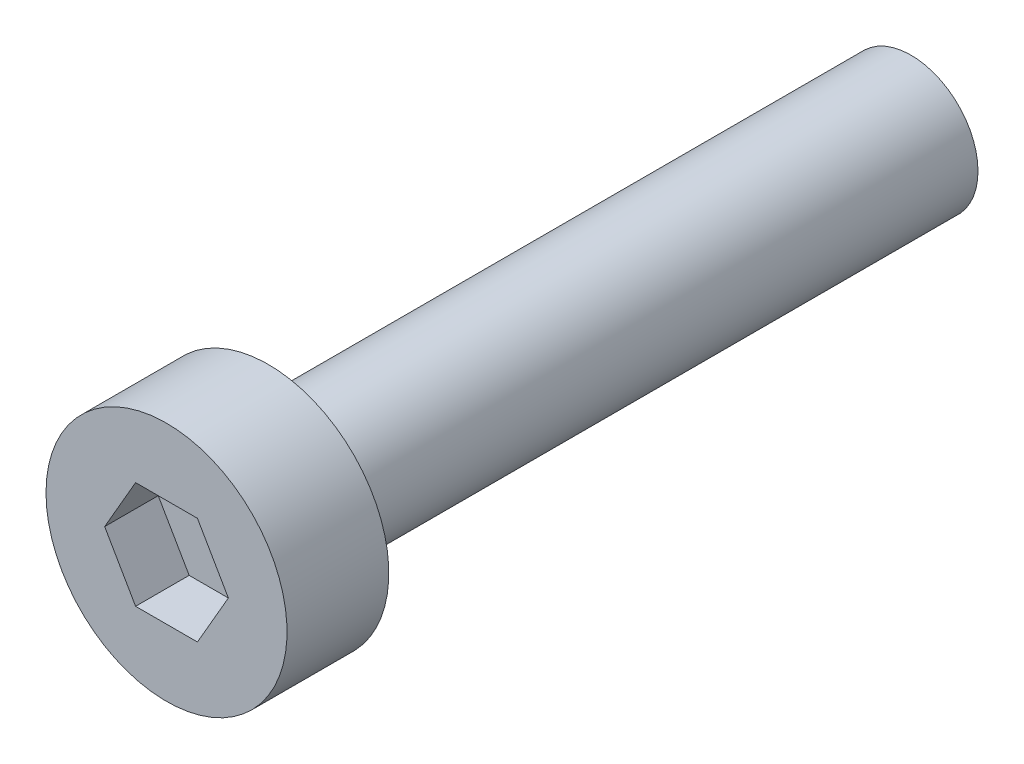
ISO-10303-21;
HEADER;
FILE_DESCRIPTION(('STEP AP214'),'2;1');
FILE_NAME('part.step','',(''),(''),'','','');
FILE_SCHEMA(('AUTOMOTIVE_DESIGN { 1 0 10303 214 1 1 1 1 }'));
ENDSEC;
DATA;
#1=APPLICATION_CONTEXT('core data for automotive mechanical design processes');
#2=APPLICATION_PROTOCOL_DEFINITION('international standard','automotive_design',2000,#1);
#3=PRODUCT_CONTEXT('',#1,'mechanical');
#4=PRODUCT('Part','Part','',(#3));
#5=PRODUCT_RELATED_PRODUCT_CATEGORY('part','',(#4));
#6=PRODUCT_DEFINITION_FORMATION('','',#4);
#7=PRODUCT_DEFINITION_CONTEXT('part definition',#1,'design');
#8=PRODUCT_DEFINITION('design','',#6,#7);
#9=PRODUCT_DEFINITION_SHAPE('','',#8);
#10=(LENGTH_UNIT() NAMED_UNIT(*) SI_UNIT(.MILLI.,.METRE.));
#11=(NAMED_UNIT(*) PLANE_ANGLE_UNIT() SI_UNIT($,.RADIAN.));
#12=(NAMED_UNIT(*) SI_UNIT($,.STERADIAN.) SOLID_ANGLE_UNIT());
#13=UNCERTAINTY_MEASURE_WITH_UNIT(LENGTH_MEASURE(1.E-05),#10,'distance_accuracy_value','');
#14=(GEOMETRIC_REPRESENTATION_CONTEXT(3) GLOBAL_UNCERTAINTY_ASSIGNED_CONTEXT((#13)) GLOBAL_UNIT_ASSIGNED_CONTEXT((#10,
#11,#12)) REPRESENTATION_CONTEXT('',''));
#15=CARTESIAN_POINT('',(0.,0.,0.));
#16=DIRECTION('',(0.,0.,1.));
#17=DIRECTION('',(1.,0.,0.));
#18=AXIS2_PLACEMENT_3D('',#15,#16,#17);
#19=CARTESIAN_POINT('',(0.,0.,12.));
#20=DIRECTION('',(0.,0.,-1.));
#21=DIRECTION('',(-1.,0.,0.));
#22=AXIS2_PLACEMENT_3D('',#19,#20,#21);
#23=CYLINDRICAL_SURFACE('',#22,1.25);
#24=CARTESIAN_POINT('',(0.,0.,12.));
#25=DIRECTION('',(0.,0.,1.));
#26=DIRECTION('',(1.,0.,0.));
#27=AXIS2_PLACEMENT_3D('',#24,#25,#26);
#28=CIRCLE('',#27,1.25);
#29=CARTESIAN_POINT('',(1.25,0.,12.));
#30=VERTEX_POINT('',#29);
#31=EDGE_CURVE('E11',#30,#30,#28,.T.);
#32=ORIENTED_EDGE('',*,*,#31,.F.);
#33=EDGE_LOOP('',(#32));
#34=FACE_BOUND('',#33,.T.);
#35=CARTESIAN_POINT('',(0.,0.,0.));
#36=DIRECTION('',(0.,0.,1.));
#37=DIRECTION('',(1.,0.,0.));
#38=AXIS2_PLACEMENT_3D('',#35,#36,#37);
#39=CIRCLE('',#38,1.25);
#40=CARTESIAN_POINT('',(1.25,0.,0.));
#41=VERTEX_POINT('',#40);
#42=EDGE_CURVE('E37',#41,#41,#39,.T.);
#43=ORIENTED_EDGE('',*,*,#42,.T.);
#44=EDGE_LOOP('',(#43));
#45=FACE_BOUND('',#44,.T.);
#46=ADVANCED_FACE('F34',(#34,#45),#23,.T.);
#47=CARTESIAN_POINT('',(0.,0.,0.));
#48=DIRECTION('',(0.,0.,1.));
#49=DIRECTION('',(1.,0.,0.));
#50=AXIS2_PLACEMENT_3D('',#47,#48,#49);
#51=PLANE('',#50);
#52=ORIENTED_EDGE('',*,*,#42,.F.);
#53=EDGE_LOOP('',(#52));
#54=FACE_BOUND('',#53,.T.);
#55=ADVANCED_FACE('F165',(#54),#51,.F.);
#56=CARTESIAN_POINT('',(0.,0.,13.9));
#57=DIRECTION('',(0.,0.,-1.));
#58=DIRECTION('',(-1.,0.,0.));
#59=AXIS2_PLACEMENT_3D('',#56,#57,#58);
#60=CYLINDRICAL_SURFACE('',#59,2.25);
#61=CARTESIAN_POINT('',(0.,0.,13.9));
#62=DIRECTION('',(0.,0.,1.));
#63=DIRECTION('',(1.,0.,0.));
#64=AXIS2_PLACEMENT_3D('',#61,#62,#63);
#65=CIRCLE('',#64,2.25);
#66=CARTESIAN_POINT('',(-2.25,0.,13.9));
#67=VERTEX_POINT('',#66);
#68=EDGE_CURVE('E141',#67,#67,#65,.T.);
#69=CARTESIAN_POINT('',(0.,0.,12.));
#70=DIRECTION('',(0.,0.,1.));
#71=DIRECTION('',(1.,0.,0.));
#72=AXIS2_PLACEMENT_3D('',#69,#70,#71);
#73=CIRCLE('',#72,2.25);
#74=CARTESIAN_POINT('',(-2.25,0.,12.));
#75=VERTEX_POINT('',#74);
#76=EDGE_CURVE('E135',#75,#75,#73,.T.);
#77=CARTESIAN_POINT('',(-2.25,0.,13.9));
#78=CARTESIAN_POINT('',(-2.25,0.,13.8802083333333));
#79=CARTESIAN_POINT('',(-2.25,0.,13.8604166666667));
#80=CARTESIAN_POINT('',(-2.25,0.,13.8208333333333));
#81=CARTESIAN_POINT('',(-2.25,0.,13.8010416666667));
#82=CARTESIAN_POINT('',(-2.25,0.,13.7614583333333));
#83=CARTESIAN_POINT('',(-2.25,0.,13.7416666666667));
#84=CARTESIAN_POINT('',(-2.25,0.,13.7020833333333));
#85=CARTESIAN_POINT('',(-2.25,0.,13.6822916666667));
#86=CARTESIAN_POINT('',(-2.25,0.,13.6427083333333));
#87=CARTESIAN_POINT('',(-2.25,0.,13.6229166666667));
#88=CARTESIAN_POINT('',(-2.25,0.,13.5833333333333));
#89=CARTESIAN_POINT('',(-2.25,0.,13.5635416666667));
#90=CARTESIAN_POINT('',(-2.25,0.,13.5239583333333));
#91=CARTESIAN_POINT('',(-2.25,0.,13.5041666666667));
#92=CARTESIAN_POINT('',(-2.25,0.,13.4645833333333));
#93=CARTESIAN_POINT('',(-2.25,0.,13.4447916666667));
#94=CARTESIAN_POINT('',(-2.25,0.,13.4052083333333));
#95=CARTESIAN_POINT('',(-2.25,0.,13.3854166666667));
#96=CARTESIAN_POINT('',(-2.25,0.,13.3458333333333));
#97=CARTESIAN_POINT('',(-2.25,0.,13.3260416666667));
#98=CARTESIAN_POINT('',(-2.25,0.,13.2864583333333));
#99=CARTESIAN_POINT('',(-2.25,0.,13.2666666666667));
#100=CARTESIAN_POINT('',(-2.25,0.,13.2270833333333));
#101=CARTESIAN_POINT('',(-2.25,0.,13.2072916666667));
#102=CARTESIAN_POINT('',(-2.25,0.,13.1677083333333));
#103=CARTESIAN_POINT('',(-2.25,0.,13.1479166666667));
#104=CARTESIAN_POINT('',(-2.25,0.,13.1083333333333));
#105=CARTESIAN_POINT('',(-2.25,0.,13.0885416666667));
#106=CARTESIAN_POINT('',(-2.25,0.,13.0489583333333));
#107=CARTESIAN_POINT('',(-2.25,0.,13.0291666666667));
#108=CARTESIAN_POINT('',(-2.25,0.,12.9895833333333));
#109=CARTESIAN_POINT('',(-2.25,0.,12.9697916666667));
#110=CARTESIAN_POINT('',(-2.25,0.,12.9302083333333));
#111=CARTESIAN_POINT('',(-2.25,0.,12.9104166666667));
#112=CARTESIAN_POINT('',(-2.25,0.,12.8708333333333));
#113=CARTESIAN_POINT('',(-2.25,0.,12.8510416666667));
#114=CARTESIAN_POINT('',(-2.25,0.,12.8114583333333));
#115=CARTESIAN_POINT('',(-2.25,0.,12.7916666666667));
#116=CARTESIAN_POINT('',(-2.25,0.,12.7520833333333));
#117=CARTESIAN_POINT('',(-2.25,0.,12.7322916666667));
#118=CARTESIAN_POINT('',(-2.25,0.,12.6927083333333));
#119=CARTESIAN_POINT('',(-2.25,0.,12.6729166666667));
#120=CARTESIAN_POINT('',(-2.25,0.,12.6333333333333));
#121=CARTESIAN_POINT('',(-2.25,0.,12.6135416666667));
#122=CARTESIAN_POINT('',(-2.25,0.,12.5739583333333));
#123=CARTESIAN_POINT('',(-2.25,0.,12.5541666666667));
#124=CARTESIAN_POINT('',(-2.25,0.,12.5145833333333));
#125=CARTESIAN_POINT('',(-2.25,0.,12.4947916666667));
#126=CARTESIAN_POINT('',(-2.25,0.,12.4552083333333));
#127=CARTESIAN_POINT('',(-2.25,0.,12.4354166666667));
#128=CARTESIAN_POINT('',(-2.25,0.,12.3958333333333));
#129=CARTESIAN_POINT('',(-2.25,0.,12.3760416666667));
#130=CARTESIAN_POINT('',(-2.25,0.,12.3364583333333));
#131=CARTESIAN_POINT('',(-2.25,0.,12.3166666666667));
#132=CARTESIAN_POINT('',(-2.25,0.,12.2770833333333));
#133=CARTESIAN_POINT('',(-2.25,0.,12.2572916666667));
#134=CARTESIAN_POINT('',(-2.25,0.,12.2177083333333));
#135=CARTESIAN_POINT('',(-2.25,0.,12.1979166666667));
#136=CARTESIAN_POINT('',(-2.25,0.,12.1583333333333));
#137=CARTESIAN_POINT('',(-2.25,0.,12.1385416666667));
#138=CARTESIAN_POINT('',(-2.25,0.,12.0989583333333));
#139=CARTESIAN_POINT('',(-2.25,0.,12.0791666666667));
#140=CARTESIAN_POINT('',(-2.25,0.,12.0395833333333));
#141=CARTESIAN_POINT('',(-2.25,0.,12.0197916666667));
#142=CARTESIAN_POINT('',(-2.25,0.,12.));
#143=B_SPLINE_CURVE_WITH_KNOTS('',3,(#77,#78,#79,#80,#81,#82,#83,#84,#85,#86,#87,#88,#89,#90,
#91,#92,#93,#94,#95,#96,#97,#98,#99,#100,#101,#102,#103,#104,#105,#106,#107,#108,#109,#110,#111,
#112,#113,#114,#115,#116,#117,#118,#119,#120,#121,#122,#123,#124,#125,#126,#127,#128,#129,#130,
#131,#132,#133,#134,#135,#136,#137,#138,#139,#140,#141,#142),.UNSPECIFIED.,.F.,.F.,(4,2,2,2,2,2,
2,2,2,2,2,2,2,2,2,2,2,2,2,2,2,2,2,2,2,2,2,2,2,2,2,2,4),(0.,0.0593749999999987,0.118749999999999,
0.178124999999999,0.2375,0.296874999999999,0.356249999999999,0.415624999999999,0.475,0.534375,
0.593749999999999,0.653124999999999,0.7125,0.771875,0.831249999999999,0.890624999999999,0.95,
1.009375,1.06875,1.128125,1.1875,1.246875,1.30625,1.365625,1.425,1.484375,1.54375,1.603125,
1.6625,1.721875,1.78125,1.840625,1.9),.UNSPECIFIED.);
#144=EDGE_CURVE('BSEAM147',#67,#75,#143,.T.);
#145=ORIENTED_EDGE('',*,*,#68,.F.);
#146=ORIENTED_EDGE('',*,*,#76,.T.);
#147=ORIENTED_EDGE('',*,*,#144,.T.);
#148=ORIENTED_EDGE('',*,*,#144,.F.);
#149=EDGE_LOOP('',(#145,#147,#146,#148));
#150=FACE_BOUND('',#149,.T.);
#151=ADVANCED_FACE('F147',(#150),#60,.T.);
#152=CARTESIAN_POINT('',(0.,0.,13.9));
#153=DIRECTION('',(0.,0.,1.));
#154=DIRECTION('',(1.,0.,0.));
#155=AXIS2_PLACEMENT_3D('',#152,#153,#154);
#156=PLANE('',#155);
#157=DIRECTION('',(0.5,0.866025403784439,0.));
#158=VECTOR('',#157,1.);
#159=CARTESIAN_POINT('',(0.577350269189626,-1.,13.9));
#160=LINE('',#159,#158);
#161=CARTESIAN_POINT('',(0.577350269189626,-1.,13.9));
#162=VERTEX_POINT('',#161);
#163=CARTESIAN_POINT('',(1.15470053837925,0.,13.9));
#164=VERTEX_POINT('',#163);
#165=EDGE_CURVE('E48',#162,#164,#160,.T.);
#166=ORIENTED_EDGE('',*,*,#165,.F.);
#167=DIRECTION('',(1.,0.,0.));
#168=VECTOR('',#167,1.);
#169=CARTESIAN_POINT('',(-0.577350269189626,-1.,13.9));
#170=LINE('',#169,#168);
#171=CARTESIAN_POINT('',(-0.577350269189626,-1.,13.9));
#172=VERTEX_POINT('',#171);
#173=EDGE_CURVE('E131',#172,#162,#170,.T.);
#174=ORIENTED_EDGE('',*,*,#173,.F.);
#175=DIRECTION('',(0.5,-0.866025403784439,0.));
#176=VECTOR('',#175,1.);
#177=CARTESIAN_POINT('',(-1.15470053837925,0.,13.9));
#178=LINE('',#177,#176);
#179=CARTESIAN_POINT('',(-1.15470053837925,0.,13.9));
#180=VERTEX_POINT('',#179);
#181=EDGE_CURVE('E129',#180,#172,#178,.T.);
#182=ORIENTED_EDGE('',*,*,#181,.F.);
#183=DIRECTION('',(-0.5,-0.866025403784439,0.));
#184=VECTOR('',#183,1.);
#185=CARTESIAN_POINT('',(-0.577350269189626,1.,13.9));
#186=LINE('',#185,#184);
#187=CARTESIAN_POINT('',(-0.577350269189626,1.,13.9));
#188=VERTEX_POINT('',#187);
#189=EDGE_CURVE('E96',#188,#180,#186,.T.);
#190=ORIENTED_EDGE('',*,*,#189,.F.);
#191=DIRECTION('',(-1.,0.,0.));
#192=VECTOR('',#191,1.);
#193=CARTESIAN_POINT('',(0.577350269189626,1.,13.9));
#194=LINE('',#193,#192);
#195=CARTESIAN_POINT('',(0.577350269189626,1.,13.9));
#196=VERTEX_POINT('',#195);
#197=EDGE_CURVE('E125',#196,#188,#194,.T.);
#198=ORIENTED_EDGE('',*,*,#197,.F.);
#199=DIRECTION('',(-0.5,0.866025403784438,0.));
#200=VECTOR('',#199,1.);
#201=CARTESIAN_POINT('',(1.15470053837925,0.,13.9));
#202=LINE('',#201,#200);
#203=EDGE_CURVE('E122',#164,#196,#202,.T.);
#204=ORIENTED_EDGE('',*,*,#203,.F.);
#205=EDGE_LOOP('',(#166,#174,#182,#190,#198,#204));
#206=FACE_BOUND('',#205,.T.);
#207=ORIENTED_EDGE('',*,*,#68,.T.);
#208=EDGE_LOOP('',(#207));
#209=FACE_BOUND('',#208,.T.);
#210=ADVANCED_FACE('F152',(#206,#209),#156,.T.);
#211=CARTESIAN_POINT('',(0.,0.,12.));
#212=DIRECTION('',(0.,0.,1.));
#213=DIRECTION('',(1.,0.,0.));
#214=AXIS2_PLACEMENT_3D('',#211,#212,#213);
#215=PLANE('',#214);
#216=ORIENTED_EDGE('',*,*,#31,.T.);
#217=EDGE_LOOP('',(#216));
#218=FACE_BOUND('',#217,.T.);
#219=ORIENTED_EDGE('',*,*,#76,.F.);
#220=EDGE_LOOP('',(#219));
#221=FACE_BOUND('',#220,.T.);
#222=ADVANCED_FACE('F149',(#218,#221),#215,.F.);
#223=CARTESIAN_POINT('',(0.577350269189626,-1.,12.9));
#224=DIRECTION('',(0.866025403784439,-0.5,0.));
#225=DIRECTION('',(0.5,0.866025403784439,0.));
#226=AXIS2_PLACEMENT_3D('',#223,#224,#225);
#227=PLANE('',#226);
#228=ORIENTED_EDGE('',*,*,#165,.T.);
#229=DIRECTION('',(0.,0.,1.));
#230=VECTOR('',#229,1.);
#231=CARTESIAN_POINT('',(1.15470053837925,0.,12.9));
#232=LINE('',#231,#230);
#233=CARTESIAN_POINT('',(1.15470053837925,0.,12.9));
#234=VERTEX_POINT('',#233);
#235=EDGE_CURVE('E78',#234,#164,#232,.T.);
#236=ORIENTED_EDGE('',*,*,#235,.F.);
#237=DIRECTION('',(0.5,0.866025403784439,0.));
#238=VECTOR('',#237,1.);
#239=CARTESIAN_POINT('',(0.577350269189626,-1.,12.9));
#240=LINE('',#239,#238);
#241=CARTESIAN_POINT('',(0.577350269189626,-1.,12.9));
#242=VERTEX_POINT('',#241);
#243=EDGE_CURVE('E133',#242,#234,#240,.T.);
#244=ORIENTED_EDGE('',*,*,#243,.F.);
#245=DIRECTION('',(0.,0.,1.));
#246=VECTOR('',#245,1.);
#247=CARTESIAN_POINT('',(0.577350269189626,-1.,12.9));
#248=LINE('',#247,#246);
#249=EDGE_CURVE('E56',#242,#162,#248,.T.);
#250=ORIENTED_EDGE('',*,*,#249,.T.);
#251=EDGE_LOOP('',(#228,#236,#244,#250));
#252=FACE_BOUND('',#251,.T.);
#253=ADVANCED_FACE('F151',(#252),#227,.F.);
#254=CARTESIAN_POINT('',(-0.577350269189626,-1.,12.9));
#255=DIRECTION('',(0.,-1.,0.));
#256=DIRECTION('',(0.,0.,-1.));
#257=AXIS2_PLACEMENT_3D('',#254,#255,#256);
#258=PLANE('',#257);
#259=ORIENTED_EDGE('',*,*,#173,.T.);
#260=ORIENTED_EDGE('',*,*,#249,.F.);
#261=DIRECTION('',(1.,0.,0.));
#262=VECTOR('',#261,1.);
#263=CARTESIAN_POINT('',(-0.577350269189626,-1.,12.9));
#264=LINE('',#263,#262);
#265=CARTESIAN_POINT('',(-0.577350269189626,-1.,12.9));
#266=VERTEX_POINT('',#265);
#267=EDGE_CURVE('E108',#266,#242,#264,.T.);
#268=ORIENTED_EDGE('',*,*,#267,.F.);
#269=DIRECTION('',(0.,0.,1.));
#270=VECTOR('',#269,1.);
#271=CARTESIAN_POINT('',(-0.577350269189626,-1.,12.9));
#272=LINE('',#271,#270);
#273=EDGE_CURVE('E100',#266,#172,#272,.T.);
#274=ORIENTED_EDGE('',*,*,#273,.T.);
#275=EDGE_LOOP('',(#259,#260,#268,#274));
#276=FACE_BOUND('',#275,.T.);
#277=ADVANCED_FACE('F159',(#276),#258,.F.);
#278=CARTESIAN_POINT('',(-1.15470053837925,0.,12.9));
#279=DIRECTION('',(-0.866025403784439,-0.5,0.));
#280=DIRECTION('',(0.5,-0.866025403784439,0.));
#281=AXIS2_PLACEMENT_3D('',#278,#279,#280);
#282=PLANE('',#281);
#283=ORIENTED_EDGE('',*,*,#181,.T.);
#284=ORIENTED_EDGE('',*,*,#273,.F.);
#285=DIRECTION('',(0.5,-0.866025403784439,0.));
#286=VECTOR('',#285,1.);
#287=CARTESIAN_POINT('',(-1.15470053837925,0.,12.9));
#288=LINE('',#287,#286);
#289=CARTESIAN_POINT('',(-1.15470053837925,0.,12.9));
#290=VERTEX_POINT('',#289);
#291=EDGE_CURVE('E104',#290,#266,#288,.T.);
#292=ORIENTED_EDGE('',*,*,#291,.F.);
#293=DIRECTION('',(0.,0.,1.));
#294=VECTOR('',#293,1.);
#295=CARTESIAN_POINT('',(-1.15470053837925,0.,12.9));
#296=LINE('',#295,#294);
#297=EDGE_CURVE('E89',#290,#180,#296,.T.);
#298=ORIENTED_EDGE('',*,*,#297,.T.);
#299=EDGE_LOOP('',(#283,#284,#292,#298));
#300=FACE_BOUND('',#299,.T.);
#301=ADVANCED_FACE('F105',(#300),#282,.F.);
#302=CARTESIAN_POINT('',(-0.577350269189626,1.,12.9));
#303=DIRECTION('',(-0.866025403784439,0.5,0.));
#304=DIRECTION('',(-0.5,-0.866025403784439,0.));
#305=AXIS2_PLACEMENT_3D('',#302,#303,#304);
#306=PLANE('',#305);
#307=ORIENTED_EDGE('',*,*,#189,.T.);
#308=ORIENTED_EDGE('',*,*,#297,.F.);
#309=DIRECTION('',(-0.5,-0.866025403784439,0.));
#310=VECTOR('',#309,1.);
#311=CARTESIAN_POINT('',(-0.577350269189626,1.,12.9));
#312=LINE('',#311,#310);
#313=CARTESIAN_POINT('',(-0.577350269189626,1.,12.9));
#314=VERTEX_POINT('',#313);
#315=EDGE_CURVE('E93',#314,#290,#312,.T.);
#316=ORIENTED_EDGE('',*,*,#315,.F.);
#317=DIRECTION('',(0.,0.,1.));
#318=VECTOR('',#317,1.);
#319=CARTESIAN_POINT('',(-0.577350269189626,1.,12.9));
#320=LINE('',#319,#318);
#321=EDGE_CURVE('E101',#314,#188,#320,.T.);
#322=ORIENTED_EDGE('',*,*,#321,.T.);
#323=EDGE_LOOP('',(#307,#308,#316,#322));
#324=FACE_BOUND('',#323,.T.);
#325=ADVANCED_FACE('F91',(#324),#306,.F.);
#326=CARTESIAN_POINT('',(0.577350269189626,1.,12.9));
#327=DIRECTION('',(0.,1.,0.));
#328=DIRECTION('',(0.,0.,1.));
#329=AXIS2_PLACEMENT_3D('',#326,#327,#328);
#330=PLANE('',#329);
#331=ORIENTED_EDGE('',*,*,#197,.T.);
#332=ORIENTED_EDGE('',*,*,#321,.F.);
#333=DIRECTION('',(-1.,0.,0.));
#334=VECTOR('',#333,1.);
#335=CARTESIAN_POINT('',(0.577350269189626,1.,12.9));
#336=LINE('',#335,#334);
#337=CARTESIAN_POINT('',(0.577350269189626,1.,12.9));
#338=VERTEX_POINT('',#337);
#339=EDGE_CURVE('E114',#338,#314,#336,.T.);
#340=ORIENTED_EDGE('',*,*,#339,.F.);
#341=DIRECTION('',(0.,0.,1.));
#342=VECTOR('',#341,1.);
#343=CARTESIAN_POINT('',(0.577350269189626,1.,12.9));
#344=LINE('',#343,#342);
#345=EDGE_CURVE('E138',#338,#196,#344,.T.);
#346=ORIENTED_EDGE('',*,*,#345,.T.);
#347=EDGE_LOOP('',(#331,#332,#340,#346));
#348=FACE_BOUND('',#347,.T.);
#349=ADVANCED_FACE('F220',(#348),#330,.F.);
#350=CARTESIAN_POINT('',(1.15470053837925,0.,12.9));
#351=DIRECTION('',(0.866025403784439,0.5,0.));
#352=DIRECTION('',(-0.5,0.866025403784438,0.));
#353=AXIS2_PLACEMENT_3D('',#350,#351,#352);
#354=PLANE('',#353);
#355=ORIENTED_EDGE('',*,*,#203,.T.);
#356=ORIENTED_EDGE('',*,*,#345,.F.);
#357=DIRECTION('',(-0.5,0.866025403784438,0.));
#358=VECTOR('',#357,1.);
#359=CARTESIAN_POINT('',(1.15470053837925,0.,12.9));
#360=LINE('',#359,#358);
#361=EDGE_CURVE('E116',#234,#338,#360,.T.);
#362=ORIENTED_EDGE('',*,*,#361,.F.);
#363=ORIENTED_EDGE('',*,*,#235,.T.);
#364=EDGE_LOOP('',(#355,#356,#362,#363));
#365=FACE_BOUND('',#364,.T.);
#366=ADVANCED_FACE('F229',(#365),#354,.F.);
#367=CARTESIAN_POINT('',(0.,0.,12.9));
#368=DIRECTION('',(0.,0.,1.));
#369=DIRECTION('',(1.,0.,0.));
#370=AXIS2_PLACEMENT_3D('',#367,#368,#369);
#371=PLANE('',#370);
#372=ORIENTED_EDGE('',*,*,#243,.T.);
#373=ORIENTED_EDGE('',*,*,#361,.T.);
#374=ORIENTED_EDGE('',*,*,#339,.T.);
#375=ORIENTED_EDGE('',*,*,#315,.T.);
#376=ORIENTED_EDGE('',*,*,#291,.T.);
#377=ORIENTED_EDGE('',*,*,#267,.T.);
#378=EDGE_LOOP('',(#372,#373,#374,#375,#376,#377));
#379=FACE_BOUND('',#378,.T.);
#380=ADVANCED_FACE('F111',(#379),#371,.T.);
#381=CLOSED_SHELL('',(#46,#55,#151,#210,#222,#253,#277,#301,#325,#349,#366,#380));
#382=MANIFOLD_SOLID_BREP('B2',#381);
#383=ADVANCED_BREP_SHAPE_REPRESENTATION('',(#18,#382),#14);
#384=SHAPE_DEFINITION_REPRESENTATION(#9,#383);
ENDSEC;
END-ISO-10303-21;
